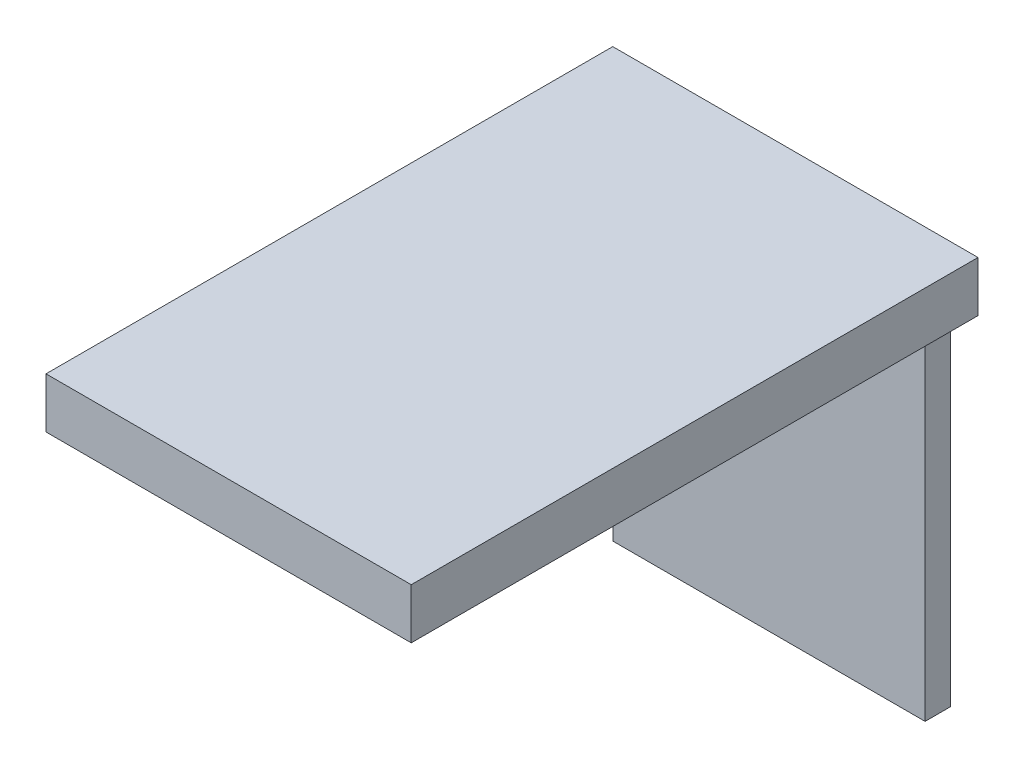
ISO-10303-21;
HEADER;
FILE_DESCRIPTION(('STEP AP214'),'2;1');
FILE_NAME('part.step','',(''),(''),'','','');
FILE_SCHEMA(('AUTOMOTIVE_DESIGN { 1 0 10303 214 1 1 1 1 }'));
ENDSEC;
DATA;
#1=APPLICATION_CONTEXT('core data for automotive mechanical design processes');
#2=APPLICATION_PROTOCOL_DEFINITION('international standard','automotive_design',2000,#1);
#3=PRODUCT_CONTEXT('',#1,'mechanical');
#4=PRODUCT('Part','Part','',(#3));
#5=PRODUCT_RELATED_PRODUCT_CATEGORY('part','',(#4));
#6=PRODUCT_DEFINITION_FORMATION('','',#4);
#7=PRODUCT_DEFINITION_CONTEXT('part definition',#1,'design');
#8=PRODUCT_DEFINITION('design','',#6,#7);
#9=PRODUCT_DEFINITION_SHAPE('','',#8);
#10=(LENGTH_UNIT() NAMED_UNIT(*) SI_UNIT(.MILLI.,.METRE.));
#11=(NAMED_UNIT(*) PLANE_ANGLE_UNIT() SI_UNIT($,.RADIAN.));
#12=(NAMED_UNIT(*) SI_UNIT($,.STERADIAN.) SOLID_ANGLE_UNIT());
#13=UNCERTAINTY_MEASURE_WITH_UNIT(LENGTH_MEASURE(1.E-05),#10,'distance_accuracy_value','');
#14=(GEOMETRIC_REPRESENTATION_CONTEXT(3) GLOBAL_UNCERTAINTY_ASSIGNED_CONTEXT((#13)) GLOBAL_UNIT_ASSIGNED_CONTEXT((#10,
#11,#12)) REPRESENTATION_CONTEXT('',''));
#15=CARTESIAN_POINT('',(0.,0.,0.));
#16=DIRECTION('',(0.,0.,1.));
#17=DIRECTION('',(1.,0.,0.));
#18=AXIS2_PLACEMENT_3D('',#15,#16,#17);
#19=CARTESIAN_POINT('',(0.,0.,0.));
#20=DIRECTION('',(0.,1.,0.));
#21=DIRECTION('',(0.,0.,1.));
#22=AXIS2_PLACEMENT_3D('',#19,#20,#21);
#23=PLANE('',#22);
#24=DIRECTION('',(0.,0.,-1.));
#25=VECTOR('',#24,1.);
#26=CARTESIAN_POINT('',(-12.5,0.,-20.5));
#27=LINE('',#26,#25);
#28=CARTESIAN_POINT('',(-12.5,0.,-20.5));
#29=VERTEX_POINT('',#28);
#30=CARTESIAN_POINT('',(-12.5,0.,-22.5));
#31=VERTEX_POINT('',#30);
#32=EDGE_CURVE('E37',#29,#31,#27,.T.);
#33=ORIENTED_EDGE('',*,*,#32,.F.);
#34=DIRECTION('',(0.,0.,1.));
#35=VECTOR('',#34,1.);
#36=CARTESIAN_POINT('',(-12.5,0.,-20.5));
#37=LINE('',#36,#35);
#38=CARTESIAN_POINT('',(-12.5,0.,20.5));
#39=VERTEX_POINT('',#38);
#40=EDGE_CURVE('E194',#29,#39,#37,.T.);
#41=ORIENTED_EDGE('',*,*,#40,.T.);
#42=DIRECTION('',(1.,0.,0.));
#43=VECTOR('',#42,1.);
#44=CARTESIAN_POINT('',(-12.5,0.,20.5));
#45=LINE('',#44,#43);
#46=CARTESIAN_POINT('',(12.5,0.,20.5));
#47=VERTEX_POINT('',#46);
#48=EDGE_CURVE('E181',#39,#47,#45,.T.);
#49=ORIENTED_EDGE('',*,*,#48,.T.);
#50=DIRECTION('',(0.,0.,-1.));
#51=VECTOR('',#50,1.);
#52=CARTESIAN_POINT('',(12.5,0.,-20.5));
#53=LINE('',#52,#51);
#54=CARTESIAN_POINT('',(12.5,0.,-20.5));
#55=VERTEX_POINT('',#54);
#56=EDGE_CURVE('E176',#47,#55,#53,.T.);
#57=ORIENTED_EDGE('',*,*,#56,.T.);
#58=DIRECTION('',(-1.,0.,0.));
#59=VECTOR('',#58,1.);
#60=CARTESIAN_POINT('',(-12.5,0.,-20.5));
#61=LINE('',#60,#59);
#62=CARTESIAN_POINT('',(12.3,0.,-20.5));
#63=VERTEX_POINT('',#62);
#64=EDGE_CURVE('E160',#55,#63,#61,.T.);
#65=ORIENTED_EDGE('',*,*,#64,.T.);
#66=DIRECTION('',(0.,0.,1.));
#67=VECTOR('',#66,1.);
#68=CARTESIAN_POINT('',(12.3,0.,-20.5));
#69=LINE('',#68,#67);
#70=CARTESIAN_POINT('',(12.3,0.,-22.5));
#71=VERTEX_POINT('',#70);
#72=EDGE_CURVE('E58',#71,#63,#69,.T.);
#73=ORIENTED_EDGE('',*,*,#72,.F.);
#74=DIRECTION('',(-1.,0.,0.));
#75=VECTOR('',#74,1.);
#76=CARTESIAN_POINT('',(-14.5,0.,-22.5));
#77=LINE('',#76,#75);
#78=CARTESIAN_POINT('',(14.5,0.,-22.5));
#79=VERTEX_POINT('',#78);
#80=EDGE_CURVE('E218',#79,#71,#77,.T.);
#81=ORIENTED_EDGE('',*,*,#80,.F.);
#82=DIRECTION('',(0.,0.,-1.));
#83=VECTOR('',#82,1.);
#84=CARTESIAN_POINT('',(14.5,0.,-22.5));
#85=LINE('',#84,#83);
#86=CARTESIAN_POINT('',(14.5,0.,22.5));
#87=VERTEX_POINT('',#86);
#88=EDGE_CURVE('E209',#87,#79,#85,.T.);
#89=ORIENTED_EDGE('',*,*,#88,.F.);
#90=DIRECTION('',(1.,0.,0.));
#91=VECTOR('',#90,1.);
#92=CARTESIAN_POINT('',(-14.5,0.,22.5));
#93=LINE('',#92,#91);
#94=CARTESIAN_POINT('',(-14.5,0.,22.5));
#95=VERTEX_POINT('',#94);
#96=EDGE_CURVE('E227',#95,#87,#93,.T.);
#97=ORIENTED_EDGE('',*,*,#96,.F.);
#98=DIRECTION('',(0.,0.,1.));
#99=VECTOR('',#98,1.);
#100=CARTESIAN_POINT('',(-14.5,0.,-22.5));
#101=LINE('',#100,#99);
#102=CARTESIAN_POINT('',(-14.5,0.,-22.5));
#103=VERTEX_POINT('',#102);
#104=EDGE_CURVE('E214',#103,#95,#101,.T.);
#105=ORIENTED_EDGE('',*,*,#104,.F.);
#106=EDGE_CURVE('E51',#31,#103,#77,.T.);
#107=ORIENTED_EDGE('',*,*,#106,.F.);
#108=EDGE_LOOP('',(#33,#41,#49,#57,#65,#73,#81,#89,#97,#105,#107));
#109=FACE_BOUND('',#108,.T.);
#110=ADVANCED_FACE('F33',(#109),#23,.F.);
#111=CARTESIAN_POINT('',(14.5,3.,-22.5));
#112=DIRECTION('',(-1.,0.,0.));
#113=DIRECTION('',(0.,0.,1.));
#114=AXIS2_PLACEMENT_3D('',#111,#112,#113);
#115=PLANE('',#114);
#116=ORIENTED_EDGE('',*,*,#88,.T.);
#117=DIRECTION('',(0.,-1.,0.));
#118=VECTOR('',#117,1.);
#119=CARTESIAN_POINT('',(14.5,3.,-22.5));
#120=LINE('',#119,#118);
#121=CARTESIAN_POINT('',(14.5,4.,-22.5));
#122=VERTEX_POINT('',#121);
#123=EDGE_CURVE('E11',#122,#79,#120,.T.);
#124=ORIENTED_EDGE('',*,*,#123,.F.);
#125=DIRECTION('',(0.,0.,-1.));
#126=VECTOR('',#125,1.);
#127=CARTESIAN_POINT('',(14.5,4.,-22.5));
#128=LINE('',#127,#126);
#129=CARTESIAN_POINT('',(14.5,4.,22.5));
#130=VERTEX_POINT('',#129);
#131=EDGE_CURVE('E142',#130,#122,#128,.T.);
#132=ORIENTED_EDGE('',*,*,#131,.F.);
#133=DIRECTION('',(0.,-1.,0.));
#134=VECTOR('',#133,1.);
#135=CARTESIAN_POINT('',(14.5,3.,22.5));
#136=LINE('',#135,#134);
#137=EDGE_CURVE('E225',#130,#87,#136,.T.);
#138=ORIENTED_EDGE('',*,*,#137,.T.);
#139=EDGE_LOOP('',(#116,#124,#132,#138));
#140=FACE_BOUND('',#139,.T.);
#141=ADVANCED_FACE('F35',(#140),#115,.F.);
#142=CARTESIAN_POINT('',(-14.5,3.,-22.5));
#143=DIRECTION('',(0.,0.,1.));
#144=DIRECTION('',(1.,0.,0.));
#145=AXIS2_PLACEMENT_3D('',#142,#143,#144);
#146=PLANE('',#145);
#147=ORIENTED_EDGE('',*,*,#80,.T.);
#148=DIRECTION('',(0.,1.,0.));
#149=VECTOR('',#148,1.);
#150=CARTESIAN_POINT('',(12.3,-28.,-22.5));
#151=LINE('',#150,#149);
#152=CARTESIAN_POINT('',(12.3,-28.,-22.5));
#153=VERTEX_POINT('',#152);
#154=EDGE_CURVE('E127',#153,#71,#151,.T.);
#155=ORIENTED_EDGE('',*,*,#154,.F.);
#156=DIRECTION('',(1.,0.,0.));
#157=VECTOR('',#156,1.);
#158=CARTESIAN_POINT('',(-12.5,-28.,-22.5));
#159=LINE('',#158,#157);
#160=CARTESIAN_POINT('',(-12.5,-28.,-22.5));
#161=VERTEX_POINT('',#160);
#162=EDGE_CURVE('E120',#161,#153,#159,.T.);
#163=ORIENTED_EDGE('',*,*,#162,.F.);
#164=DIRECTION('',(0.,1.,0.));
#165=VECTOR('',#164,1.);
#166=CARTESIAN_POINT('',(-12.5,-28.,-22.5));
#167=LINE('',#166,#165);
#168=EDGE_CURVE('E124',#161,#31,#167,.T.);
#169=ORIENTED_EDGE('',*,*,#168,.T.);
#170=ORIENTED_EDGE('',*,*,#106,.T.);
#171=DIRECTION('',(0.,-1.,0.));
#172=VECTOR('',#171,1.);
#173=CARTESIAN_POINT('',(-14.5,3.,-22.5));
#174=LINE('',#173,#172);
#175=CARTESIAN_POINT('',(-14.5,4.,-22.5));
#176=VERTEX_POINT('',#175);
#177=EDGE_CURVE('E43',#176,#103,#174,.T.);
#178=ORIENTED_EDGE('',*,*,#177,.F.);
#179=DIRECTION('',(-1.,0.,0.));
#180=VECTOR('',#179,1.);
#181=CARTESIAN_POINT('',(-14.5,4.,-22.5));
#182=LINE('',#181,#180);
#183=EDGE_CURVE('E145',#122,#176,#182,.T.);
#184=ORIENTED_EDGE('',*,*,#183,.F.);
#185=ORIENTED_EDGE('',*,*,#123,.T.);
#186=EDGE_LOOP('',(#147,#155,#163,#169,#170,#178,#184,#185));
#187=FACE_BOUND('',#186,.T.);
#188=ADVANCED_FACE('F122',(#187),#146,.F.);
#189=CARTESIAN_POINT('',(-14.5,3.,-22.5));
#190=DIRECTION('',(1.,0.,0.));
#191=DIRECTION('',(0.,0.,-1.));
#192=AXIS2_PLACEMENT_3D('',#189,#190,#191);
#193=PLANE('',#192);
#194=ORIENTED_EDGE('',*,*,#104,.T.);
#195=DIRECTION('',(0.,-1.,0.));
#196=VECTOR('',#195,1.);
#197=CARTESIAN_POINT('',(-14.5,3.,22.5));
#198=LINE('',#197,#196);
#199=CARTESIAN_POINT('',(-14.5,4.,22.5));
#200=VERTEX_POINT('',#199);
#201=EDGE_CURVE('E222',#200,#95,#198,.T.);
#202=ORIENTED_EDGE('',*,*,#201,.F.);
#203=DIRECTION('',(0.,0.,1.));
#204=VECTOR('',#203,1.);
#205=CARTESIAN_POINT('',(-14.5,4.,-22.5));
#206=LINE('',#205,#204);
#207=EDGE_CURVE('E170',#176,#200,#206,.T.);
#208=ORIENTED_EDGE('',*,*,#207,.F.);
#209=ORIENTED_EDGE('',*,*,#177,.T.);
#210=EDGE_LOOP('',(#194,#202,#208,#209));
#211=FACE_BOUND('',#210,.T.);
#212=ADVANCED_FACE('F231',(#211),#193,.F.);
#213=CARTESIAN_POINT('',(-14.5,3.,22.5));
#214=DIRECTION('',(0.,0.,-1.));
#215=DIRECTION('',(-1.,0.,0.));
#216=AXIS2_PLACEMENT_3D('',#213,#214,#215);
#217=PLANE('',#216);
#218=ORIENTED_EDGE('',*,*,#96,.T.);
#219=ORIENTED_EDGE('',*,*,#137,.F.);
#220=DIRECTION('',(1.,0.,0.));
#221=VECTOR('',#220,1.);
#222=CARTESIAN_POINT('',(-14.5,4.,22.5));
#223=LINE('',#222,#221);
#224=EDGE_CURVE('E173',#200,#130,#223,.T.);
#225=ORIENTED_EDGE('',*,*,#224,.F.);
#226=ORIENTED_EDGE('',*,*,#201,.T.);
#227=EDGE_LOOP('',(#218,#219,#225,#226));
#228=FACE_BOUND('',#227,.T.);
#229=ADVANCED_FACE('F234',(#228),#217,.F.);
#230=CARTESIAN_POINT('',(12.5,3.,-20.5));
#231=DIRECTION('',(-1.,0.,0.));
#232=DIRECTION('',(0.,0.,1.));
#233=AXIS2_PLACEMENT_3D('',#230,#231,#232);
#234=PLANE('',#233);
#235=ORIENTED_EDGE('',*,*,#56,.F.);
#236=DIRECTION('',(0.,-1.,0.));
#237=VECTOR('',#236,1.);
#238=CARTESIAN_POINT('',(12.5,3.,20.5));
#239=LINE('',#238,#237);
#240=CARTESIAN_POINT('',(12.5,3.,20.5));
#241=VERTEX_POINT('',#240);
#242=EDGE_CURVE('E190',#241,#47,#239,.T.);
#243=ORIENTED_EDGE('',*,*,#242,.F.);
#244=DIRECTION('',(0.,0.,-1.));
#245=VECTOR('',#244,1.);
#246=CARTESIAN_POINT('',(12.5,3.,-20.5));
#247=LINE('',#246,#245);
#248=CARTESIAN_POINT('',(12.5,3.,-20.5));
#249=VERTEX_POINT('',#248);
#250=EDGE_CURVE('E177',#241,#249,#247,.T.);
#251=ORIENTED_EDGE('',*,*,#250,.T.);
#252=DIRECTION('',(0.,-1.,0.));
#253=VECTOR('',#252,1.);
#254=CARTESIAN_POINT('',(12.5,3.,-20.5));
#255=LINE('',#254,#253);
#256=EDGE_CURVE('E206',#249,#55,#255,.T.);
#257=ORIENTED_EDGE('',*,*,#256,.T.);
#258=EDGE_LOOP('',(#235,#243,#251,#257));
#259=FACE_BOUND('',#258,.T.);
#260=ADVANCED_FACE('F258',(#259),#234,.T.);
#261=CARTESIAN_POINT('',(-12.5,3.,-20.5));
#262=DIRECTION('',(0.,0.,1.));
#263=DIRECTION('',(1.,0.,0.));
#264=AXIS2_PLACEMENT_3D('',#261,#262,#263);
#265=PLANE('',#264);
#266=ORIENTED_EDGE('',*,*,#64,.F.);
#267=ORIENTED_EDGE('',*,*,#256,.F.);
#268=DIRECTION('',(-1.,0.,0.));
#269=VECTOR('',#268,1.);
#270=CARTESIAN_POINT('',(-12.5,3.,-20.5));
#271=LINE('',#270,#269);
#272=CARTESIAN_POINT('',(-12.5,3.,-20.5));
#273=VERTEX_POINT('',#272);
#274=EDGE_CURVE('E180',#249,#273,#271,.T.);
#275=ORIENTED_EDGE('',*,*,#274,.T.);
#276=DIRECTION('',(0.,-1.,0.));
#277=VECTOR('',#276,1.);
#278=CARTESIAN_POINT('',(-12.5,3.,-20.5));
#279=LINE('',#278,#277);
#280=EDGE_CURVE('E203',#273,#29,#279,.T.);
#281=ORIENTED_EDGE('',*,*,#280,.T.);
#282=DIRECTION('',(0.,1.,0.));
#283=VECTOR('',#282,1.);
#284=CARTESIAN_POINT('',(-12.5,-28.,-20.5));
#285=LINE('',#284,#283);
#286=CARTESIAN_POINT('',(-12.5,-28.,-20.5));
#287=VERTEX_POINT('',#286);
#288=EDGE_CURVE('E157',#287,#29,#285,.T.);
#289=ORIENTED_EDGE('',*,*,#288,.F.);
#290=DIRECTION('',(-1.,0.,0.));
#291=VECTOR('',#290,1.);
#292=CARTESIAN_POINT('',(-12.5,-28.,-20.5));
#293=LINE('',#292,#291);
#294=CARTESIAN_POINT('',(12.3,-28.,-20.5));
#295=VERTEX_POINT('',#294);
#296=EDGE_CURVE('E136',#295,#287,#293,.T.);
#297=ORIENTED_EDGE('',*,*,#296,.F.);
#298=DIRECTION('',(0.,1.,0.));
#299=VECTOR('',#298,1.);
#300=CARTESIAN_POINT('',(12.3,-28.,-20.5));
#301=LINE('',#300,#299);
#302=EDGE_CURVE('E147',#295,#63,#301,.T.);
#303=ORIENTED_EDGE('',*,*,#302,.T.);
#304=EDGE_LOOP('',(#266,#267,#275,#281,#289,#297,#303));
#305=FACE_BOUND('',#304,.T.);
#306=ADVANCED_FACE('F246',(#305),#265,.T.);
#307=CARTESIAN_POINT('',(-12.5,3.,-20.5));
#308=DIRECTION('',(1.,0.,0.));
#309=DIRECTION('',(0.,0.,-1.));
#310=AXIS2_PLACEMENT_3D('',#307,#308,#309);
#311=PLANE('',#310);
#312=ORIENTED_EDGE('',*,*,#40,.F.);
#313=ORIENTED_EDGE('',*,*,#280,.F.);
#314=DIRECTION('',(0.,0.,1.));
#315=VECTOR('',#314,1.);
#316=CARTESIAN_POINT('',(-12.5,3.,-20.5));
#317=LINE('',#316,#315);
#318=CARTESIAN_POINT('',(-12.5,3.,20.5));
#319=VERTEX_POINT('',#318);
#320=EDGE_CURVE('E184',#273,#319,#317,.T.);
#321=ORIENTED_EDGE('',*,*,#320,.T.);
#322=DIRECTION('',(0.,-1.,0.));
#323=VECTOR('',#322,1.);
#324=CARTESIAN_POINT('',(-12.5,3.,20.5));
#325=LINE('',#324,#323);
#326=EDGE_CURVE('E201',#319,#39,#325,.T.);
#327=ORIENTED_EDGE('',*,*,#326,.T.);
#328=EDGE_LOOP('',(#312,#313,#321,#327));
#329=FACE_BOUND('',#328,.T.);
#330=ADVANCED_FACE('F251',(#329),#311,.T.);
#331=CARTESIAN_POINT('',(-12.5,3.,20.5));
#332=DIRECTION('',(0.,0.,-1.));
#333=DIRECTION('',(-1.,0.,0.));
#334=AXIS2_PLACEMENT_3D('',#331,#332,#333);
#335=PLANE('',#334);
#336=ORIENTED_EDGE('',*,*,#48,.F.);
#337=ORIENTED_EDGE('',*,*,#326,.F.);
#338=DIRECTION('',(1.,0.,0.));
#339=VECTOR('',#338,1.);
#340=CARTESIAN_POINT('',(-12.5,3.,20.5));
#341=LINE('',#340,#339);
#342=EDGE_CURVE('E187',#319,#241,#341,.T.);
#343=ORIENTED_EDGE('',*,*,#342,.T.);
#344=ORIENTED_EDGE('',*,*,#242,.T.);
#345=EDGE_LOOP('',(#336,#337,#343,#344));
#346=FACE_BOUND('',#345,.T.);
#347=ADVANCED_FACE('F255',(#346),#335,.T.);
#348=CARTESIAN_POINT('',(0.,3.,0.));
#349=DIRECTION('',(0.,1.,0.));
#350=DIRECTION('',(0.,0.,1.));
#351=AXIS2_PLACEMENT_3D('',#348,#349,#350);
#352=PLANE('',#351);
#353=ORIENTED_EDGE('',*,*,#250,.F.);
#354=ORIENTED_EDGE('',*,*,#342,.F.);
#355=ORIENTED_EDGE('',*,*,#320,.F.);
#356=ORIENTED_EDGE('',*,*,#274,.F.);
#357=EDGE_LOOP('',(#353,#354,#355,#356));
#358=FACE_BOUND('',#357,.T.);
#359=ADVANCED_FACE('F260',(#358),#352,.F.);
#360=CARTESIAN_POINT('',(0.,4.,0.));
#361=DIRECTION('',(0.,1.,0.));
#362=DIRECTION('',(0.,0.,1.));
#363=AXIS2_PLACEMENT_3D('',#360,#361,#362);
#364=PLANE('',#363);
#365=ORIENTED_EDGE('',*,*,#131,.T.);
#366=ORIENTED_EDGE('',*,*,#183,.T.);
#367=ORIENTED_EDGE('',*,*,#207,.T.);
#368=ORIENTED_EDGE('',*,*,#224,.T.);
#369=EDGE_LOOP('',(#365,#366,#367,#368));
#370=FACE_BOUND('',#369,.T.);
#371=ADVANCED_FACE('F240',(#370),#364,.T.);
#372=CARTESIAN_POINT('',(-12.5,-28.,-20.5));
#373=DIRECTION('',(1.,0.,0.));
#374=DIRECTION('',(0.,0.,-1.));
#375=AXIS2_PLACEMENT_3D('',#372,#373,#374);
#376=PLANE('',#375);
#377=ORIENTED_EDGE('',*,*,#32,.T.);
#378=ORIENTED_EDGE('',*,*,#168,.F.);
#379=DIRECTION('',(0.,0.,-1.));
#380=VECTOR('',#379,1.);
#381=CARTESIAN_POINT('',(-12.5,-28.,-20.5));
#382=LINE('',#381,#380);
#383=EDGE_CURVE('E131',#287,#161,#382,.T.);
#384=ORIENTED_EDGE('',*,*,#383,.F.);
#385=ORIENTED_EDGE('',*,*,#288,.T.);
#386=EDGE_LOOP('',(#377,#378,#384,#385));
#387=FACE_BOUND('',#386,.T.);
#388=ADVANCED_FACE('F141',(#387),#376,.F.);
#389=CARTESIAN_POINT('',(12.3,-28.,-20.5));
#390=DIRECTION('',(-1.,0.,0.));
#391=DIRECTION('',(0.,0.,1.));
#392=AXIS2_PLACEMENT_3D('',#389,#390,#391);
#393=PLANE('',#392);
#394=ORIENTED_EDGE('',*,*,#72,.T.);
#395=ORIENTED_EDGE('',*,*,#302,.F.);
#396=DIRECTION('',(0.,0.,1.));
#397=VECTOR('',#396,1.);
#398=CARTESIAN_POINT('',(12.3,-28.,-20.5));
#399=LINE('',#398,#397);
#400=EDGE_CURVE('E130',#153,#295,#399,.T.);
#401=ORIENTED_EDGE('',*,*,#400,.F.);
#402=ORIENTED_EDGE('',*,*,#154,.T.);
#403=EDGE_LOOP('',(#394,#395,#401,#402));
#404=FACE_BOUND('',#403,.T.);
#405=ADVANCED_FACE('F242',(#404),#393,.F.);
#406=CARTESIAN_POINT('',(0.,-28.,0.));
#407=DIRECTION('',(0.,-1.,0.));
#408=DIRECTION('',(0.,0.,-1.));
#409=AXIS2_PLACEMENT_3D('',#406,#407,#408);
#410=PLANE('',#409);
#411=ORIENTED_EDGE('',*,*,#383,.T.);
#412=ORIENTED_EDGE('',*,*,#162,.T.);
#413=ORIENTED_EDGE('',*,*,#400,.T.);
#414=ORIENTED_EDGE('',*,*,#296,.T.);
#415=EDGE_LOOP('',(#411,#412,#413,#414));
#416=FACE_BOUND('',#415,.T.);
#417=ADVANCED_FACE('F134',(#416),#410,.T.);
#418=CLOSED_SHELL('',(#110,#141,#188,#212,#229,#260,#306,#330,#347,#359,#371,#388,#405,#417));
#419=MANIFOLD_SOLID_BREP('B2',#418);
#420=ADVANCED_BREP_SHAPE_REPRESENTATION('',(#18,#419),#14);
#421=SHAPE_DEFINITION_REPRESENTATION(#9,#420);
ENDSEC;
END-ISO-10303-21;
